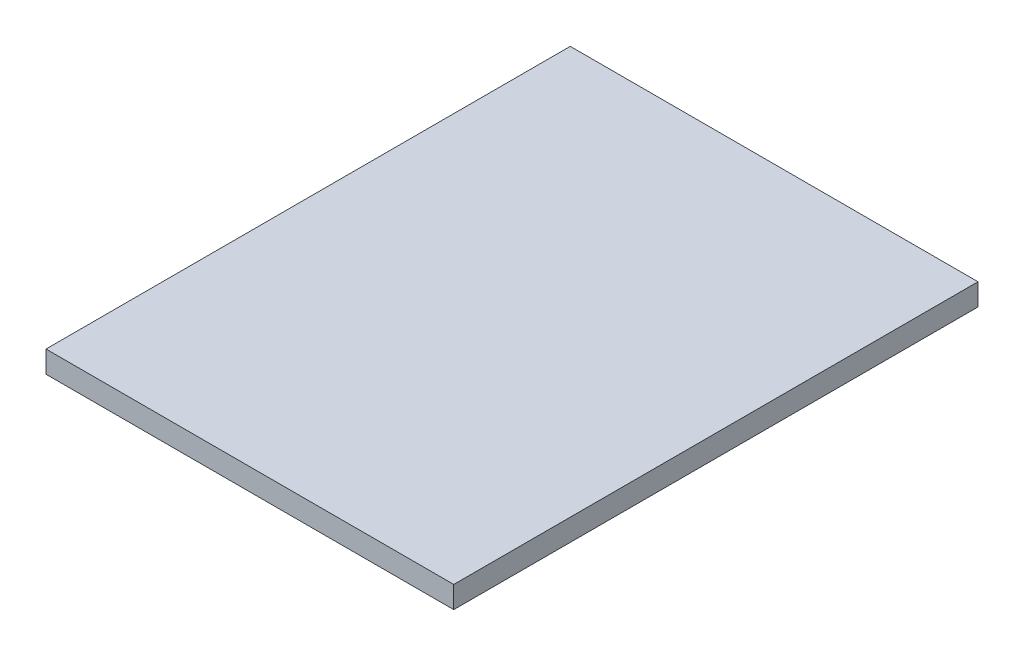
ISO-10303-21;
HEADER;
FILE_DESCRIPTION(('STEP AP214'),'2;1');
FILE_NAME('part.step','',(''),(''),'','','');
FILE_SCHEMA(('AUTOMOTIVE_DESIGN { 1 0 10303 214 1 1 1 1 }'));
ENDSEC;
DATA;
#1=APPLICATION_CONTEXT('core data for automotive mechanical design processes');
#2=APPLICATION_PROTOCOL_DEFINITION('international standard','automotive_design',2000,#1);
#3=PRODUCT_CONTEXT('',#1,'mechanical');
#4=PRODUCT('Part','Part','',(#3));
#5=PRODUCT_RELATED_PRODUCT_CATEGORY('part','',(#4));
#6=PRODUCT_DEFINITION_FORMATION('','',#4);
#7=PRODUCT_DEFINITION_CONTEXT('part definition',#1,'design');
#8=PRODUCT_DEFINITION('design','',#6,#7);
#9=PRODUCT_DEFINITION_SHAPE('','',#8);
#10=(LENGTH_UNIT() NAMED_UNIT(*) SI_UNIT(.MILLI.,.METRE.));
#11=(NAMED_UNIT(*) PLANE_ANGLE_UNIT() SI_UNIT($,.RADIAN.));
#12=(NAMED_UNIT(*) SI_UNIT($,.STERADIAN.) SOLID_ANGLE_UNIT());
#13=UNCERTAINTY_MEASURE_WITH_UNIT(LENGTH_MEASURE(1.E-05),#10,'distance_accuracy_value','');
#14=(GEOMETRIC_REPRESENTATION_CONTEXT(3) GLOBAL_UNCERTAINTY_ASSIGNED_CONTEXT((#13)) GLOBAL_UNIT_ASSIGNED_CONTEXT((#10,
#11,#12)) REPRESENTATION_CONTEXT('',''));
#15=CARTESIAN_POINT('',(0.,0.,0.));
#16=DIRECTION('',(0.,0.,1.));
#17=DIRECTION('',(1.,0.,0.));
#18=AXIS2_PLACEMENT_3D('',#15,#16,#17);
#19=CARTESIAN_POINT('',(-88.9,9.525,-114.3));
#20=DIRECTION('',(1.,0.,0.));
#21=DIRECTION('',(0.,0.,-1.));
#22=AXIS2_PLACEMENT_3D('',#19,#20,#21);
#23=PLANE('',#22);
#24=DIRECTION('',(0.,0.,1.));
#25=VECTOR('',#24,1.);
#26=CARTESIAN_POINT('',(-88.9,0.,-114.3));
#27=LINE('',#26,#25);
#28=CARTESIAN_POINT('',(-88.9,0.,-114.3));
#29=VERTEX_POINT('',#28);
#30=CARTESIAN_POINT('',(-88.9,0.,114.3));
#31=VERTEX_POINT('',#30);
#32=EDGE_CURVE('E111',#29,#31,#27,.T.);
#33=ORIENTED_EDGE('',*,*,#32,.T.);
#34=DIRECTION('',(0.,-1.,0.));
#35=VECTOR('',#34,1.);
#36=CARTESIAN_POINT('',(-88.9,9.525,114.3));
#37=LINE('',#36,#35);
#38=CARTESIAN_POINT('',(-88.9,9.525,114.3));
#39=VERTEX_POINT('',#38);
#40=EDGE_CURVE('E11',#39,#31,#37,.T.);
#41=ORIENTED_EDGE('',*,*,#40,.F.);
#42=DIRECTION('',(0.,0.,1.));
#43=VECTOR('',#42,1.);
#44=CARTESIAN_POINT('',(-88.9,9.525,-114.3));
#45=LINE('',#44,#43);
#46=CARTESIAN_POINT('',(-88.9,9.525,-114.3));
#47=VERTEX_POINT('',#46);
#48=EDGE_CURVE('E93',#47,#39,#45,.T.);
#49=ORIENTED_EDGE('',*,*,#48,.F.);
#50=DIRECTION('',(0.,-1.,0.));
#51=VECTOR('',#50,1.);
#52=CARTESIAN_POINT('',(-88.9,9.525,-114.3));
#53=LINE('',#52,#51);
#54=EDGE_CURVE('E60',#47,#29,#53,.T.);
#55=ORIENTED_EDGE('',*,*,#54,.T.);
#56=EDGE_LOOP('',(#33,#41,#49,#55));
#57=FACE_BOUND('',#56,.T.);
#58=ADVANCED_FACE('F43',(#57),#23,.F.);
#59=CARTESIAN_POINT('',(-88.9,9.525,114.3));
#60=DIRECTION('',(0.,0.,-1.));
#61=DIRECTION('',(-1.,0.,0.));
#62=AXIS2_PLACEMENT_3D('',#59,#60,#61);
#63=PLANE('',#62);
#64=DIRECTION('',(1.,0.,0.));
#65=VECTOR('',#64,1.);
#66=CARTESIAN_POINT('',(-88.9,0.,114.3));
#67=LINE('',#66,#65);
#68=CARTESIAN_POINT('',(88.9,0.,114.3));
#69=VERTEX_POINT('',#68);
#70=EDGE_CURVE('E99',#31,#69,#67,.T.);
#71=ORIENTED_EDGE('',*,*,#70,.T.);
#72=DIRECTION('',(0.,-1.,0.));
#73=VECTOR('',#72,1.);
#74=CARTESIAN_POINT('',(88.9,9.525,114.3));
#75=LINE('',#74,#73);
#76=CARTESIAN_POINT('',(88.9,9.525,114.3));
#77=VERTEX_POINT('',#76);
#78=EDGE_CURVE('E52',#77,#69,#75,.T.);
#79=ORIENTED_EDGE('',*,*,#78,.F.);
#80=DIRECTION('',(1.,0.,0.));
#81=VECTOR('',#80,1.);
#82=CARTESIAN_POINT('',(-88.9,9.525,114.3));
#83=LINE('',#82,#81);
#84=EDGE_CURVE('E85',#39,#77,#83,.T.);
#85=ORIENTED_EDGE('',*,*,#84,.F.);
#86=ORIENTED_EDGE('',*,*,#40,.T.);
#87=EDGE_LOOP('',(#71,#79,#85,#86));
#88=FACE_BOUND('',#87,.T.);
#89=ADVANCED_FACE('F98',(#88),#63,.F.);
#90=CARTESIAN_POINT('',(88.9,9.525,-114.3));
#91=DIRECTION('',(1.,0.,0.));
#92=DIRECTION('',(0.,0.,-1.));
#93=AXIS2_PLACEMENT_3D('',#90,#91,#92);
#94=PLANE('',#93);
#95=DIRECTION('',(0.,0.,1.));
#96=VECTOR('',#95,1.);
#97=CARTESIAN_POINT('',(88.9,0.,-114.3));
#98=LINE('',#97,#96);
#99=CARTESIAN_POINT('',(88.9,0.,-114.3));
#100=VERTEX_POINT('',#99);
#101=EDGE_CURVE('E116',#100,#69,#98,.T.);
#102=ORIENTED_EDGE('',*,*,#101,.F.);
#103=DIRECTION('',(0.,-1.,0.));
#104=VECTOR('',#103,1.);
#105=CARTESIAN_POINT('',(88.9,9.525,-114.3));
#106=LINE('',#105,#104);
#107=CARTESIAN_POINT('',(88.9,9.525,-114.3));
#108=VERTEX_POINT('',#107);
#109=EDGE_CURVE('E74',#108,#100,#106,.T.);
#110=ORIENTED_EDGE('',*,*,#109,.F.);
#111=DIRECTION('',(0.,0.,1.));
#112=VECTOR('',#111,1.);
#113=CARTESIAN_POINT('',(88.9,9.525,-114.3));
#114=LINE('',#113,#112);
#115=EDGE_CURVE('E92',#108,#77,#114,.T.);
#116=ORIENTED_EDGE('',*,*,#115,.T.);
#117=ORIENTED_EDGE('',*,*,#78,.T.);
#118=EDGE_LOOP('',(#102,#110,#116,#117));
#119=FACE_BOUND('',#118,.T.);
#120=ADVANCED_FACE('F103',(#119),#94,.T.);
#121=CARTESIAN_POINT('',(-88.9,9.525,-114.3));
#122=DIRECTION('',(0.,0.,-1.));
#123=DIRECTION('',(-1.,0.,0.));
#124=AXIS2_PLACEMENT_3D('',#121,#122,#123);
#125=PLANE('',#124);
#126=DIRECTION('',(1.,0.,0.));
#127=VECTOR('',#126,1.);
#128=CARTESIAN_POINT('',(-88.9,0.,-114.3));
#129=LINE('',#128,#127);
#130=EDGE_CURVE('E119',#29,#100,#129,.T.);
#131=ORIENTED_EDGE('',*,*,#130,.F.);
#132=ORIENTED_EDGE('',*,*,#54,.F.);
#133=DIRECTION('',(1.,0.,0.));
#134=VECTOR('',#133,1.);
#135=CARTESIAN_POINT('',(-88.9,9.525,-114.3));
#136=LINE('',#135,#134);
#137=EDGE_CURVE('E105',#47,#108,#136,.T.);
#138=ORIENTED_EDGE('',*,*,#137,.T.);
#139=ORIENTED_EDGE('',*,*,#109,.T.);
#140=EDGE_LOOP('',(#131,#132,#138,#139));
#141=FACE_BOUND('',#140,.T.);
#142=ADVANCED_FACE('F129',(#141),#125,.T.);
#143=CARTESIAN_POINT('',(0.,9.525,0.));
#144=DIRECTION('',(0.,1.,0.));
#145=DIRECTION('',(0.,0.,1.));
#146=AXIS2_PLACEMENT_3D('',#143,#144,#145);
#147=PLANE('',#146);
#148=ORIENTED_EDGE('',*,*,#48,.T.);
#149=ORIENTED_EDGE('',*,*,#84,.T.);
#150=ORIENTED_EDGE('',*,*,#115,.F.);
#151=ORIENTED_EDGE('',*,*,#137,.F.);
#152=EDGE_LOOP('',(#148,#149,#150,#151));
#153=FACE_BOUND('',#152,.T.);
#154=ADVANCED_FACE('F89',(#153),#147,.T.);
#155=CARTESIAN_POINT('',(0.,0.,0.));
#156=DIRECTION('',(0.,1.,0.));
#157=DIRECTION('',(0.,0.,1.));
#158=AXIS2_PLACEMENT_3D('',#155,#156,#157);
#159=PLANE('',#158);
#160=ORIENTED_EDGE('',*,*,#32,.F.);
#161=ORIENTED_EDGE('',*,*,#130,.T.);
#162=ORIENTED_EDGE('',*,*,#101,.T.);
#163=ORIENTED_EDGE('',*,*,#70,.F.);
#164=EDGE_LOOP('',(#160,#161,#162,#163));
#165=FACE_BOUND('',#164,.T.);
#166=ADVANCED_FACE('F128',(#165),#159,.F.);
#167=CLOSED_SHELL('',(#58,#89,#120,#142,#154,#166));
#168=MANIFOLD_SOLID_BREP('B2',#167);
#169=ADVANCED_BREP_SHAPE_REPRESENTATION('',(#18,#168),#14);
#170=SHAPE_DEFINITION_REPRESENTATION(#9,#169);
ENDSEC;
END-ISO-10303-21;
